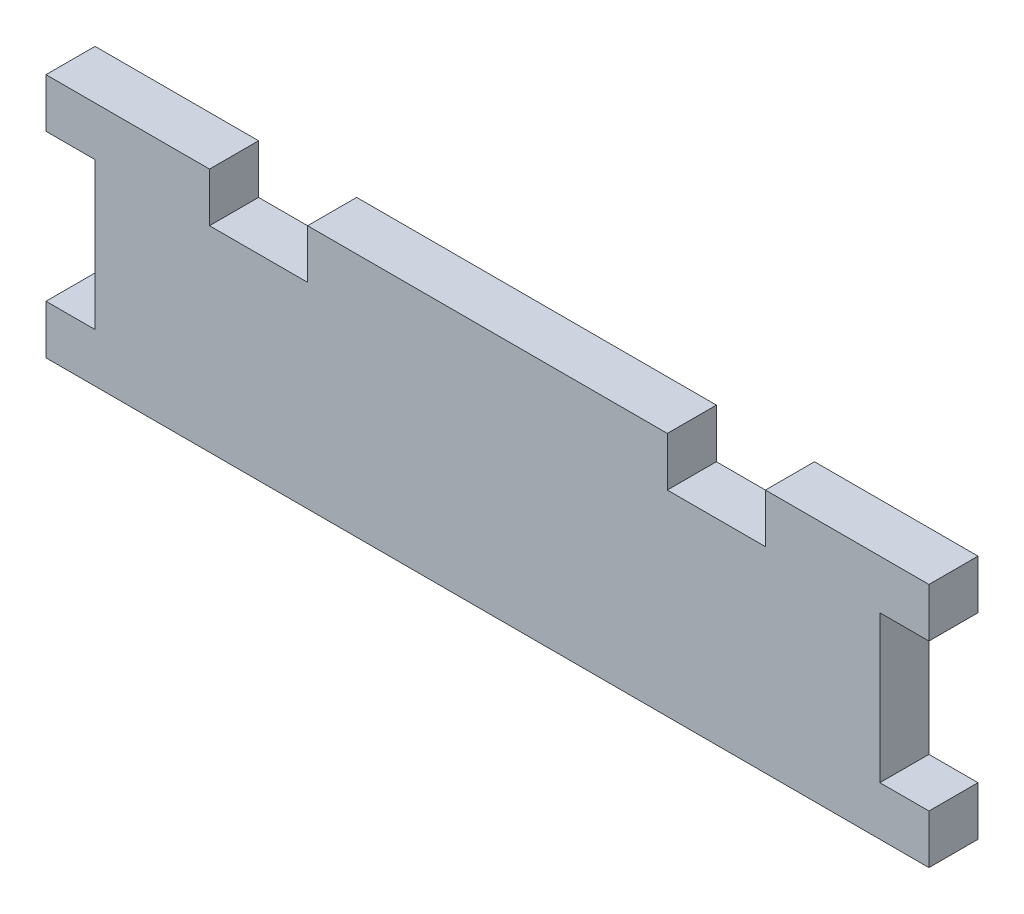
ISO-10303-21;
HEADER;
FILE_DESCRIPTION(('STEP AP214'),'2;1');
FILE_NAME('part.step','',(''),(''),'','','');
FILE_SCHEMA(('AUTOMOTIVE_DESIGN { 1 0 10303 214 1 1 1 1 }'));
ENDSEC;
DATA;
#1=APPLICATION_CONTEXT('core data for automotive mechanical design processes');
#2=APPLICATION_PROTOCOL_DEFINITION('international standard','automotive_design',2000,#1);
#3=PRODUCT_CONTEXT('',#1,'mechanical');
#4=PRODUCT('Part','Part','',(#3));
#5=PRODUCT_RELATED_PRODUCT_CATEGORY('part','',(#4));
#6=PRODUCT_DEFINITION_FORMATION('','',#4);
#7=PRODUCT_DEFINITION_CONTEXT('part definition',#1,'design');
#8=PRODUCT_DEFINITION('design','',#6,#7);
#9=PRODUCT_DEFINITION_SHAPE('','',#8);
#10=(LENGTH_UNIT() NAMED_UNIT(*) SI_UNIT(.MILLI.,.METRE.));
#11=(NAMED_UNIT(*) PLANE_ANGLE_UNIT() SI_UNIT($,.RADIAN.));
#12=(NAMED_UNIT(*) SI_UNIT($,.STERADIAN.) SOLID_ANGLE_UNIT());
#13=UNCERTAINTY_MEASURE_WITH_UNIT(LENGTH_MEASURE(1.E-05),#10,'distance_accuracy_value','');
#14=(GEOMETRIC_REPRESENTATION_CONTEXT(3) GLOBAL_UNCERTAINTY_ASSIGNED_CONTEXT((#13)) GLOBAL_UNIT_ASSIGNED_CONTEXT((#10,
#11,#12)) REPRESENTATION_CONTEXT('',''));
#15=CARTESIAN_POINT('',(0.,0.,0.));
#16=DIRECTION('',(0.,0.,1.));
#17=DIRECTION('',(1.,0.,0.));
#18=AXIS2_PLACEMENT_3D('',#15,#16,#17);
#19=CARTESIAN_POINT('',(38.,0.,3.));
#20=DIRECTION('',(1.,0.,0.));
#21=DIRECTION('',(0.,0.,-1.));
#22=AXIS2_PLACEMENT_3D('',#19,#20,#21);
#23=PLANE('',#22);
#24=DIRECTION('',(0.,-1.,0.));
#25=VECTOR('',#24,1.);
#26=CARTESIAN_POINT('',(38.,0.,0.));
#27=LINE('',#26,#25);
#28=CARTESIAN_POINT('',(38.,15.,0.));
#29=VERTEX_POINT('',#28);
#30=CARTESIAN_POINT('',(38.,12.,0.));
#31=VERTEX_POINT('',#30);
#32=EDGE_CURVE('E274',#29,#31,#27,.T.);
#33=ORIENTED_EDGE('',*,*,#32,.F.);
#34=DIRECTION('',(0.,0.,-1.));
#35=VECTOR('',#34,1.);
#36=CARTESIAN_POINT('',(38.,15.,3.));
#37=LINE('',#36,#35);
#38=CARTESIAN_POINT('',(38.,15.,3.));
#39=VERTEX_POINT('',#38);
#40=EDGE_CURVE('E11',#39,#29,#37,.T.);
#41=ORIENTED_EDGE('',*,*,#40,.F.);
#42=DIRECTION('',(0.,-1.,0.));
#43=VECTOR('',#42,1.);
#44=CARTESIAN_POINT('',(38.,0.,3.));
#45=LINE('',#44,#43);
#46=CARTESIAN_POINT('',(38.,12.,3.));
#47=VERTEX_POINT('',#46);
#48=EDGE_CURVE('E211',#39,#47,#45,.T.);
#49=ORIENTED_EDGE('',*,*,#48,.T.);
#50=DIRECTION('',(0.,0.,-1.));
#51=VECTOR('',#50,1.);
#52=CARTESIAN_POINT('',(38.,12.,3.));
#53=LINE('',#52,#51);
#54=EDGE_CURVE('E124',#47,#31,#53,.T.);
#55=ORIENTED_EDGE('',*,*,#54,.T.);
#56=EDGE_LOOP('',(#33,#41,#49,#55));
#57=FACE_BOUND('',#56,.T.);
#58=ADVANCED_FACE('F38',(#57),#23,.T.);
#59=CARTESIAN_POINT('',(0.,15.,3.));
#60=DIRECTION('',(0.,1.,0.));
#61=DIRECTION('',(-1.,0.,0.));
#62=AXIS2_PLACEMENT_3D('',#59,#60,#61);
#63=PLANE('',#62);
#64=DIRECTION('',(1.,0.,0.));
#65=VECTOR('',#64,1.);
#66=CARTESIAN_POINT('',(0.,15.,0.));
#67=LINE('',#66,#65);
#68=CARTESIAN_POINT('',(16.,15.,0.));
#69=VERTEX_POINT('',#68);
#70=EDGE_CURVE('E268',#69,#29,#67,.T.);
#71=ORIENTED_EDGE('',*,*,#70,.F.);
#72=DIRECTION('',(0.,0.,-1.));
#73=VECTOR('',#72,1.);
#74=CARTESIAN_POINT('',(16.,15.,3.));
#75=LINE('',#74,#73);
#76=CARTESIAN_POINT('',(16.,15.,3.));
#77=VERTEX_POINT('',#76);
#78=EDGE_CURVE('E46',#77,#69,#75,.T.);
#79=ORIENTED_EDGE('',*,*,#78,.F.);
#80=DIRECTION('',(1.,0.,0.));
#81=VECTOR('',#80,1.);
#82=CARTESIAN_POINT('',(0.,15.,3.));
#83=LINE('',#82,#81);
#84=EDGE_CURVE('E200',#77,#39,#83,.T.);
#85=ORIENTED_EDGE('',*,*,#84,.T.);
#86=ORIENTED_EDGE('',*,*,#40,.T.);
#87=EDGE_LOOP('',(#71,#79,#85,#86));
#88=FACE_BOUND('',#87,.T.);
#89=ADVANCED_FACE('F273',(#88),#63,.T.);
#90=CARTESIAN_POINT('',(16.,0.,3.));
#91=DIRECTION('',(1.,0.,0.));
#92=DIRECTION('',(0.,0.,-1.));
#93=AXIS2_PLACEMENT_3D('',#90,#91,#92);
#94=PLANE('',#93);
#95=DIRECTION('',(0.,-1.,0.));
#96=VECTOR('',#95,1.);
#97=CARTESIAN_POINT('',(16.,0.,0.));
#98=LINE('',#97,#96);
#99=CARTESIAN_POINT('',(16.,12.,0.));
#100=VERTEX_POINT('',#99);
#101=EDGE_CURVE('E262',#69,#100,#98,.T.);
#102=ORIENTED_EDGE('',*,*,#101,.T.);
#103=DIRECTION('',(0.,0.,-1.));
#104=VECTOR('',#103,1.);
#105=CARTESIAN_POINT('',(16.,12.,3.));
#106=LINE('',#105,#104);
#107=CARTESIAN_POINT('',(16.,12.,3.));
#108=VERTEX_POINT('',#107);
#109=EDGE_CURVE('E255',#108,#100,#106,.T.);
#110=ORIENTED_EDGE('',*,*,#109,.F.);
#111=DIRECTION('',(0.,-1.,0.));
#112=VECTOR('',#111,1.);
#113=CARTESIAN_POINT('',(16.,0.,3.));
#114=LINE('',#113,#112);
#115=EDGE_CURVE('E210',#77,#108,#114,.T.);
#116=ORIENTED_EDGE('',*,*,#115,.F.);
#117=ORIENTED_EDGE('',*,*,#78,.T.);
#118=EDGE_LOOP('',(#102,#110,#116,#117));
#119=FACE_BOUND('',#118,.T.);
#120=ADVANCED_FACE('F260',(#119),#94,.F.);
#121=CARTESIAN_POINT('',(0.,12.,3.));
#122=DIRECTION('',(0.,1.,0.));
#123=DIRECTION('',(0.,0.,1.));
#124=AXIS2_PLACEMENT_3D('',#121,#122,#123);
#125=PLANE('',#124);
#126=DIRECTION('',(1.,0.,0.));
#127=VECTOR('',#126,1.);
#128=CARTESIAN_POINT('',(0.,12.,0.));
#129=LINE('',#128,#127);
#130=CARTESIAN_POINT('',(10.,12.,0.));
#131=VERTEX_POINT('',#130);
#132=EDGE_CURVE('E271',#131,#100,#129,.T.);
#133=ORIENTED_EDGE('',*,*,#132,.F.);
#134=DIRECTION('',(0.,0.,-1.));
#135=VECTOR('',#134,1.);
#136=CARTESIAN_POINT('',(10.,12.,3.));
#137=LINE('',#136,#135);
#138=CARTESIAN_POINT('',(10.,12.,3.));
#139=VERTEX_POINT('',#138);
#140=EDGE_CURVE('E253',#139,#131,#137,.T.);
#141=ORIENTED_EDGE('',*,*,#140,.F.);
#142=DIRECTION('',(1.,0.,0.));
#143=VECTOR('',#142,1.);
#144=CARTESIAN_POINT('',(0.,12.,3.));
#145=LINE('',#144,#143);
#146=EDGE_CURVE('E214',#139,#108,#145,.T.);
#147=ORIENTED_EDGE('',*,*,#146,.T.);
#148=ORIENTED_EDGE('',*,*,#109,.T.);
#149=EDGE_LOOP('',(#133,#141,#147,#148));
#150=FACE_BOUND('',#149,.T.);
#151=ADVANCED_FACE('F323',(#150),#125,.T.);
#152=CARTESIAN_POINT('',(10.,0.,3.));
#153=DIRECTION('',(1.,0.,0.));
#154=DIRECTION('',(0.,0.,-1.));
#155=AXIS2_PLACEMENT_3D('',#152,#153,#154);
#156=PLANE('',#155);
#157=DIRECTION('',(0.,-1.,0.));
#158=VECTOR('',#157,1.);
#159=CARTESIAN_POINT('',(10.,0.,0.));
#160=LINE('',#159,#158);
#161=CARTESIAN_POINT('',(10.,15.,0.));
#162=VERTEX_POINT('',#161);
#163=EDGE_CURVE('E281',#162,#131,#160,.T.);
#164=ORIENTED_EDGE('',*,*,#163,.F.);
#165=DIRECTION('',(0.,0.,-1.));
#166=VECTOR('',#165,1.);
#167=CARTESIAN_POINT('',(10.,15.,3.));
#168=LINE('',#167,#166);
#169=CARTESIAN_POINT('',(10.,15.,3.));
#170=VERTEX_POINT('',#169);
#171=EDGE_CURVE('E251',#170,#162,#168,.T.);
#172=ORIENTED_EDGE('',*,*,#171,.F.);
#173=DIRECTION('',(0.,-1.,0.));
#174=VECTOR('',#173,1.);
#175=CARTESIAN_POINT('',(10.,0.,3.));
#176=LINE('',#175,#174);
#177=EDGE_CURVE('E208',#170,#139,#176,.T.);
#178=ORIENTED_EDGE('',*,*,#177,.T.);
#179=ORIENTED_EDGE('',*,*,#140,.T.);
#180=EDGE_LOOP('',(#164,#172,#178,#179));
#181=FACE_BOUND('',#180,.T.);
#182=ADVANCED_FACE('F328',(#181),#156,.T.);
#183=CARTESIAN_POINT('',(0.,15.,0.));
#184=VERTEX_POINT('',#183);
#185=EDGE_CURVE('E276',#184,#162,#67,.T.);
#186=ORIENTED_EDGE('',*,*,#185,.F.);
#187=DIRECTION('',(0.,0.,-1.));
#188=VECTOR('',#187,1.);
#189=CARTESIAN_POINT('',(0.,15.,3.));
#190=LINE('',#189,#188);
#191=CARTESIAN_POINT('',(0.,15.,3.));
#192=VERTEX_POINT('',#191);
#193=EDGE_CURVE('E249',#192,#184,#190,.T.);
#194=ORIENTED_EDGE('',*,*,#193,.F.);
#195=EDGE_CURVE('E199',#192,#170,#83,.T.);
#196=ORIENTED_EDGE('',*,*,#195,.T.);
#197=ORIENTED_EDGE('',*,*,#171,.T.);
#198=EDGE_LOOP('',(#186,#194,#196,#197));
#199=FACE_BOUND('',#198,.T.);
#200=ADVANCED_FACE('F319',(#199),#63,.T.);
#201=CARTESIAN_POINT('',(0.,0.,3.));
#202=DIRECTION('',(-1.,0.,0.));
#203=DIRECTION('',(0.,0.,1.));
#204=AXIS2_PLACEMENT_3D('',#201,#202,#203);
#205=PLANE('',#204);
#206=DIRECTION('',(0.,1.,0.));
#207=VECTOR('',#206,1.);
#208=CARTESIAN_POINT('',(0.,0.,0.));
#209=LINE('',#208,#207);
#210=CARTESIAN_POINT('',(0.,12.,0.));
#211=VERTEX_POINT('',#210);
#212=EDGE_CURVE('E280',#211,#184,#209,.T.);
#213=ORIENTED_EDGE('',*,*,#212,.F.);
#214=DIRECTION('',(0.,0.,-1.));
#215=VECTOR('',#214,1.);
#216=CARTESIAN_POINT('',(0.,12.,3.));
#217=LINE('',#216,#215);
#218=CARTESIAN_POINT('',(0.,12.,3.));
#219=VERTEX_POINT('',#218);
#220=EDGE_CURVE('E247',#219,#211,#217,.T.);
#221=ORIENTED_EDGE('',*,*,#220,.F.);
#222=DIRECTION('',(0.,1.,0.));
#223=VECTOR('',#222,1.);
#224=CARTESIAN_POINT('',(0.,0.,3.));
#225=LINE('',#224,#223);
#226=EDGE_CURVE('E207',#219,#192,#225,.T.);
#227=ORIENTED_EDGE('',*,*,#226,.T.);
#228=ORIENTED_EDGE('',*,*,#193,.T.);
#229=EDGE_LOOP('',(#213,#221,#227,#228));
#230=FACE_BOUND('',#229,.T.);
#231=ADVANCED_FACE('F327',(#230),#205,.T.);
#232=CARTESIAN_POINT('',(0.,12.,3.));
#233=DIRECTION('',(0.,1.,0.));
#234=DIRECTION('',(0.,0.,1.));
#235=AXIS2_PLACEMENT_3D('',#232,#233,#234);
#236=PLANE('',#235);
#237=DIRECTION('',(1.,0.,0.));
#238=VECTOR('',#237,1.);
#239=CARTESIAN_POINT('',(0.,12.,0.));
#240=LINE('',#239,#238);
#241=CARTESIAN_POINT('',(3.,12.,0.));
#242=VERTEX_POINT('',#241);
#243=EDGE_CURVE('E284',#211,#242,#240,.T.);
#244=ORIENTED_EDGE('',*,*,#243,.T.);
#245=DIRECTION('',(0.,0.,-1.));
#246=VECTOR('',#245,1.);
#247=CARTESIAN_POINT('',(3.,12.,3.));
#248=LINE('',#247,#246);
#249=CARTESIAN_POINT('',(3.,12.,3.));
#250=VERTEX_POINT('',#249);
#251=EDGE_CURVE('E244',#250,#242,#248,.T.);
#252=ORIENTED_EDGE('',*,*,#251,.F.);
#253=DIRECTION('',(1.,0.,0.));
#254=VECTOR('',#253,1.);
#255=CARTESIAN_POINT('',(0.,12.,3.));
#256=LINE('',#255,#254);
#257=EDGE_CURVE('E385',#219,#250,#256,.T.);
#258=ORIENTED_EDGE('',*,*,#257,.F.);
#259=ORIENTED_EDGE('',*,*,#220,.T.);
#260=EDGE_LOOP('',(#244,#252,#258,#259));
#261=FACE_BOUND('',#260,.T.);
#262=ADVANCED_FACE('F404',(#261),#236,.F.);
#263=CARTESIAN_POINT('',(3.,0.,3.));
#264=DIRECTION('',(1.,0.,0.));
#265=DIRECTION('',(0.,1.,0.));
#266=AXIS2_PLACEMENT_3D('',#263,#264,#265);
#267=PLANE('',#266);
#268=DIRECTION('',(0.,-1.,0.));
#269=VECTOR('',#268,1.);
#270=CARTESIAN_POINT('',(3.,0.,0.));
#271=LINE('',#270,#269);
#272=CARTESIAN_POINT('',(3.,3.,0.));
#273=VERTEX_POINT('',#272);
#274=EDGE_CURVE('E292',#242,#273,#271,.T.);
#275=ORIENTED_EDGE('',*,*,#274,.T.);
#276=DIRECTION('',(0.,0.,-1.));
#277=VECTOR('',#276,1.);
#278=CARTESIAN_POINT('',(3.,3.,3.));
#279=LINE('',#278,#277);
#280=CARTESIAN_POINT('',(3.,3.,3.));
#281=VERTEX_POINT('',#280);
#282=EDGE_CURVE('E242',#281,#273,#279,.T.);
#283=ORIENTED_EDGE('',*,*,#282,.F.);
#284=DIRECTION('',(0.,-1.,0.));
#285=VECTOR('',#284,1.);
#286=CARTESIAN_POINT('',(3.,0.,3.));
#287=LINE('',#286,#285);
#288=EDGE_CURVE('E383',#250,#281,#287,.T.);
#289=ORIENTED_EDGE('',*,*,#288,.F.);
#290=ORIENTED_EDGE('',*,*,#251,.T.);
#291=EDGE_LOOP('',(#275,#283,#289,#290));
#292=FACE_BOUND('',#291,.T.);
#293=ADVANCED_FACE('F411',(#292),#267,.F.);
#294=CARTESIAN_POINT('',(0.,3.,3.));
#295=DIRECTION('',(0.,1.,0.));
#296=DIRECTION('',(0.,0.,1.));
#297=AXIS2_PLACEMENT_3D('',#294,#295,#296);
#298=PLANE('',#297);
#299=DIRECTION('',(1.,0.,0.));
#300=VECTOR('',#299,1.);
#301=CARTESIAN_POINT('',(0.,3.,0.));
#302=LINE('',#301,#300);
#303=CARTESIAN_POINT('',(0.,3.,0.));
#304=VERTEX_POINT('',#303);
#305=EDGE_CURVE('E295',#304,#273,#302,.T.);
#306=ORIENTED_EDGE('',*,*,#305,.F.);
#307=DIRECTION('',(0.,0.,-1.));
#308=VECTOR('',#307,1.);
#309=CARTESIAN_POINT('',(0.,3.,3.));
#310=LINE('',#309,#308);
#311=CARTESIAN_POINT('',(0.,3.,3.));
#312=VERTEX_POINT('',#311);
#313=EDGE_CURVE('E240',#312,#304,#310,.T.);
#314=ORIENTED_EDGE('',*,*,#313,.F.);
#315=DIRECTION('',(1.,0.,0.));
#316=VECTOR('',#315,1.);
#317=CARTESIAN_POINT('',(0.,3.,3.));
#318=LINE('',#317,#316);
#319=EDGE_CURVE('E380',#312,#281,#318,.T.);
#320=ORIENTED_EDGE('',*,*,#319,.T.);
#321=ORIENTED_EDGE('',*,*,#282,.T.);
#322=EDGE_LOOP('',(#306,#314,#320,#321));
#323=FACE_BOUND('',#322,.T.);
#324=ADVANCED_FACE('F415',(#323),#298,.T.);
#325=CARTESIAN_POINT('',(0.,0.,0.));
#326=VERTEX_POINT('',#325);
#327=EDGE_CURVE('E286',#326,#304,#209,.T.);
#328=ORIENTED_EDGE('',*,*,#327,.F.);
#329=DIRECTION('',(0.,0.,-1.));
#330=VECTOR('',#329,1.);
#331=CARTESIAN_POINT('',(0.,0.,3.));
#332=LINE('',#331,#330);
#333=CARTESIAN_POINT('',(0.,0.,3.));
#334=VERTEX_POINT('',#333);
#335=EDGE_CURVE('E238',#334,#326,#332,.T.);
#336=ORIENTED_EDGE('',*,*,#335,.F.);
#337=EDGE_CURVE('E379',#334,#312,#225,.T.);
#338=ORIENTED_EDGE('',*,*,#337,.T.);
#339=ORIENTED_EDGE('',*,*,#313,.T.);
#340=EDGE_LOOP('',(#328,#336,#338,#339));
#341=FACE_BOUND('',#340,.T.);
#342=ADVANCED_FACE('F354',(#341),#205,.T.);
#343=CARTESIAN_POINT('',(0.,0.,3.));
#344=DIRECTION('',(0.,1.,0.));
#345=DIRECTION('',(0.,0.,1.));
#346=AXIS2_PLACEMENT_3D('',#343,#344,#345);
#347=PLANE('',#346);
#348=DIRECTION('',(1.,0.,0.));
#349=VECTOR('',#348,1.);
#350=CARTESIAN_POINT('',(0.,0.,0.));
#351=LINE('',#350,#349);
#352=CARTESIAN_POINT('',(54.,0.,0.));
#353=VERTEX_POINT('',#352);
#354=EDGE_CURVE('E298',#326,#353,#351,.T.);
#355=ORIENTED_EDGE('',*,*,#354,.T.);
#356=DIRECTION('',(0.,0.,-1.));
#357=VECTOR('',#356,1.);
#358=CARTESIAN_POINT('',(54.,0.,3.));
#359=LINE('',#358,#357);
#360=CARTESIAN_POINT('',(54.,0.,3.));
#361=VERTEX_POINT('',#360);
#362=EDGE_CURVE('E235',#361,#353,#359,.T.);
#363=ORIENTED_EDGE('',*,*,#362,.F.);
#364=DIRECTION('',(1.,0.,0.));
#365=VECTOR('',#364,1.);
#366=CARTESIAN_POINT('',(0.,0.,3.));
#367=LINE('',#366,#365);
#368=EDGE_CURVE('E377',#334,#361,#367,.T.);
#369=ORIENTED_EDGE('',*,*,#368,.F.);
#370=ORIENTED_EDGE('',*,*,#335,.T.);
#371=EDGE_LOOP('',(#355,#363,#369,#370));
#372=FACE_BOUND('',#371,.T.);
#373=ADVANCED_FACE('F346',(#372),#347,.F.);
#374=CARTESIAN_POINT('',(54.,0.,3.));
#375=DIRECTION('',(-1.,0.,0.));
#376=DIRECTION('',(0.,0.,1.));
#377=AXIS2_PLACEMENT_3D('',#374,#375,#376);
#378=PLANE('',#377);
#379=DIRECTION('',(0.,1.,0.));
#380=VECTOR('',#379,1.);
#381=CARTESIAN_POINT('',(54.,0.,0.));
#382=LINE('',#381,#380);
#383=CARTESIAN_POINT('',(54.,3.,0.));
#384=VERTEX_POINT('',#383);
#385=EDGE_CURVE('E300',#353,#384,#382,.T.);
#386=ORIENTED_EDGE('',*,*,#385,.T.);
#387=DIRECTION('',(0.,0.,-1.));
#388=VECTOR('',#387,1.);
#389=CARTESIAN_POINT('',(54.,3.,3.));
#390=LINE('',#389,#388);
#391=CARTESIAN_POINT('',(54.,3.,3.));
#392=VERTEX_POINT('',#391);
#393=EDGE_CURVE('E232',#392,#384,#390,.T.);
#394=ORIENTED_EDGE('',*,*,#393,.F.);
#395=DIRECTION('',(0.,1.,0.));
#396=VECTOR('',#395,1.);
#397=CARTESIAN_POINT('',(54.,0.,3.));
#398=LINE('',#397,#396);
#399=EDGE_CURVE('E203',#361,#392,#398,.T.);
#400=ORIENTED_EDGE('',*,*,#399,.F.);
#401=ORIENTED_EDGE('',*,*,#362,.T.);
#402=EDGE_LOOP('',(#386,#394,#400,#401));
#403=FACE_BOUND('',#402,.T.);
#404=ADVANCED_FACE('F337',(#403),#378,.F.);
#405=CARTESIAN_POINT('',(0.,3.,3.));
#406=DIRECTION('',(0.,-1.,0.));
#407=DIRECTION('',(0.,0.,-1.));
#408=AXIS2_PLACEMENT_3D('',#405,#406,#407);
#409=PLANE('',#408);
#410=DIRECTION('',(-1.,0.,0.));
#411=VECTOR('',#410,1.);
#412=CARTESIAN_POINT('',(0.,3.,0.));
#413=LINE('',#412,#411);
#414=CARTESIAN_POINT('',(51.,3.,0.));
#415=VERTEX_POINT('',#414);
#416=EDGE_CURVE('E302',#384,#415,#413,.T.);
#417=ORIENTED_EDGE('',*,*,#416,.T.);
#418=DIRECTION('',(0.,0.,-1.));
#419=VECTOR('',#418,1.);
#420=CARTESIAN_POINT('',(51.,3.,3.));
#421=LINE('',#420,#419);
#422=CARTESIAN_POINT('',(51.,3.,3.));
#423=VERTEX_POINT('',#422);
#424=EDGE_CURVE('E230',#423,#415,#421,.T.);
#425=ORIENTED_EDGE('',*,*,#424,.F.);
#426=DIRECTION('',(-1.,0.,0.));
#427=VECTOR('',#426,1.);
#428=CARTESIAN_POINT('',(0.,3.,3.));
#429=LINE('',#428,#427);
#430=EDGE_CURVE('E365',#392,#423,#429,.T.);
#431=ORIENTED_EDGE('',*,*,#430,.F.);
#432=ORIENTED_EDGE('',*,*,#393,.T.);
#433=EDGE_LOOP('',(#417,#425,#431,#432));
#434=FACE_BOUND('',#433,.T.);
#435=ADVANCED_FACE('F345',(#434),#409,.F.);
#436=CARTESIAN_POINT('',(51.,0.,3.));
#437=DIRECTION('',(1.,0.,0.));
#438=DIRECTION('',(0.,0.,-1.));
#439=AXIS2_PLACEMENT_3D('',#436,#437,#438);
#440=PLANE('',#439);
#441=DIRECTION('',(0.,-1.,0.));
#442=VECTOR('',#441,1.);
#443=CARTESIAN_POINT('',(51.,0.,0.));
#444=LINE('',#443,#442);
#445=CARTESIAN_POINT('',(51.,12.,0.));
#446=VERTEX_POINT('',#445);
#447=EDGE_CURVE('E305',#446,#415,#444,.T.);
#448=ORIENTED_EDGE('',*,*,#447,.F.);
#449=DIRECTION('',(0.,0.,-1.));
#450=VECTOR('',#449,1.);
#451=CARTESIAN_POINT('',(51.,12.,3.));
#452=LINE('',#451,#450);
#453=CARTESIAN_POINT('',(51.,12.,3.));
#454=VERTEX_POINT('',#453);
#455=EDGE_CURVE('E228',#454,#446,#452,.T.);
#456=ORIENTED_EDGE('',*,*,#455,.F.);
#457=DIRECTION('',(0.,-1.,0.));
#458=VECTOR('',#457,1.);
#459=CARTESIAN_POINT('',(51.,0.,3.));
#460=LINE('',#459,#458);
#461=EDGE_CURVE('E370',#454,#423,#460,.T.);
#462=ORIENTED_EDGE('',*,*,#461,.T.);
#463=ORIENTED_EDGE('',*,*,#424,.T.);
#464=EDGE_LOOP('',(#448,#456,#462,#463));
#465=FACE_BOUND('',#464,.T.);
#466=ADVANCED_FACE('F341',(#465),#440,.T.);
#467=CARTESIAN_POINT('',(0.,12.,3.));
#468=DIRECTION('',(0.,-1.,0.));
#469=DIRECTION('',(1.,0.,0.));
#470=AXIS2_PLACEMENT_3D('',#467,#468,#469);
#471=PLANE('',#470);
#472=DIRECTION('',(-1.,0.,0.));
#473=VECTOR('',#472,1.);
#474=CARTESIAN_POINT('',(0.,12.,0.));
#475=LINE('',#474,#473);
#476=CARTESIAN_POINT('',(54.,12.,0.));
#477=VERTEX_POINT('',#476);
#478=EDGE_CURVE('E307',#477,#446,#475,.T.);
#479=ORIENTED_EDGE('',*,*,#478,.F.);
#480=DIRECTION('',(0.,0.,-1.));
#481=VECTOR('',#480,1.);
#482=CARTESIAN_POINT('',(54.,12.,3.));
#483=LINE('',#482,#481);
#484=CARTESIAN_POINT('',(54.,12.,3.));
#485=VERTEX_POINT('',#484);
#486=EDGE_CURVE('E226',#485,#477,#483,.T.);
#487=ORIENTED_EDGE('',*,*,#486,.F.);
#488=DIRECTION('',(-1.,0.,0.));
#489=VECTOR('',#488,1.);
#490=CARTESIAN_POINT('',(0.,12.,3.));
#491=LINE('',#490,#489);
#492=EDGE_CURVE('E201',#485,#454,#491,.T.);
#493=ORIENTED_EDGE('',*,*,#492,.T.);
#494=ORIENTED_EDGE('',*,*,#455,.T.);
#495=EDGE_LOOP('',(#479,#487,#493,#494));
#496=FACE_BOUND('',#495,.T.);
#497=ADVANCED_FACE('F336',(#496),#471,.T.);
#498=CARTESIAN_POINT('',(54.,15.,0.));
#499=VERTEX_POINT('',#498);
#500=EDGE_CURVE('E278',#477,#499,#382,.T.);
#501=ORIENTED_EDGE('',*,*,#500,.T.);
#502=DIRECTION('',(0.,0.,-1.));
#503=VECTOR('',#502,1.);
#504=CARTESIAN_POINT('',(54.,15.,3.));
#505=LINE('',#504,#503);
#506=CARTESIAN_POINT('',(54.,15.,3.));
#507=VERTEX_POINT('',#506);
#508=EDGE_CURVE('E187',#507,#499,#505,.T.);
#509=ORIENTED_EDGE('',*,*,#508,.F.);
#510=EDGE_CURVE('E196',#485,#507,#398,.T.);
#511=ORIENTED_EDGE('',*,*,#510,.F.);
#512=ORIENTED_EDGE('',*,*,#486,.T.);
#513=EDGE_LOOP('',(#501,#509,#511,#512));
#514=FACE_BOUND('',#513,.T.);
#515=ADVANCED_FACE('F313',(#514),#378,.F.);
#516=CARTESIAN_POINT('',(44.,15.,0.));
#517=VERTEX_POINT('',#516);
#518=EDGE_CURVE('E186',#517,#499,#67,.T.);
#519=ORIENTED_EDGE('',*,*,#518,.F.);
#520=DIRECTION('',(0.,0.,-1.));
#521=VECTOR('',#520,1.);
#522=CARTESIAN_POINT('',(44.,15.,3.));
#523=LINE('',#522,#521);
#524=CARTESIAN_POINT('',(44.,15.,3.));
#525=VERTEX_POINT('',#524);
#526=EDGE_CURVE('E180',#525,#517,#523,.T.);
#527=ORIENTED_EDGE('',*,*,#526,.F.);
#528=EDGE_CURVE('E184',#525,#507,#83,.T.);
#529=ORIENTED_EDGE('',*,*,#528,.T.);
#530=ORIENTED_EDGE('',*,*,#508,.T.);
#531=EDGE_LOOP('',(#519,#527,#529,#530));
#532=FACE_BOUND('',#531,.T.);
#533=ADVANCED_FACE('F182',(#532),#63,.T.);
#534=CARTESIAN_POINT('',(44.,1.01770443923973E-13,3.));
#535=DIRECTION('',(1.,0.,0.));
#536=DIRECTION('',(0.,1.,0.));
#537=AXIS2_PLACEMENT_3D('',#534,#535,#536);
#538=PLANE('',#537);
#539=DIRECTION('',(0.,-1.,0.));
#540=VECTOR('',#539,1.);
#541=CARTESIAN_POINT('',(44.,1.01770443923973E-13,0.));
#542=LINE('',#541,#540);
#543=CARTESIAN_POINT('',(44.,12.,0.));
#544=VERTEX_POINT('',#543);
#545=EDGE_CURVE('E117',#517,#544,#542,.T.);
#546=ORIENTED_EDGE('',*,*,#545,.T.);
#547=DIRECTION('',(0.,0.,-1.));
#548=VECTOR('',#547,1.);
#549=CARTESIAN_POINT('',(44.,12.,3.));
#550=LINE('',#549,#548);
#551=CARTESIAN_POINT('',(44.,12.,3.));
#552=VERTEX_POINT('',#551);
#553=EDGE_CURVE('E188',#552,#544,#550,.T.);
#554=ORIENTED_EDGE('',*,*,#553,.F.);
#555=DIRECTION('',(0.,-1.,0.));
#556=VECTOR('',#555,1.);
#557=CARTESIAN_POINT('',(44.,1.01770443923973E-13,3.));
#558=LINE('',#557,#556);
#559=EDGE_CURVE('E190',#525,#552,#558,.T.);
#560=ORIENTED_EDGE('',*,*,#559,.F.);
#561=ORIENTED_EDGE('',*,*,#526,.T.);
#562=EDGE_LOOP('',(#546,#554,#560,#561));
#563=FACE_BOUND('',#562,.T.);
#564=ADVANCED_FACE('F191',(#563),#538,.F.);
#565=CARTESIAN_POINT('',(0.,12.,3.));
#566=DIRECTION('',(0.,-1.,0.));
#567=DIRECTION('',(0.,0.,-1.));
#568=AXIS2_PLACEMENT_3D('',#565,#566,#567);
#569=PLANE('',#568);
#570=DIRECTION('',(-1.,0.,0.));
#571=VECTOR('',#570,1.);
#572=CARTESIAN_POINT('',(0.,12.,0.));
#573=LINE('',#572,#571);
#574=EDGE_CURVE('E215',#544,#31,#573,.T.);
#575=ORIENTED_EDGE('',*,*,#574,.T.);
#576=ORIENTED_EDGE('',*,*,#54,.F.);
#577=DIRECTION('',(-1.,0.,0.));
#578=VECTOR('',#577,1.);
#579=CARTESIAN_POINT('',(0.,12.,3.));
#580=LINE('',#579,#578);
#581=EDGE_CURVE('E54',#552,#47,#580,.T.);
#582=ORIENTED_EDGE('',*,*,#581,.F.);
#583=ORIENTED_EDGE('',*,*,#553,.T.);
#584=EDGE_LOOP('',(#575,#576,#582,#583));
#585=FACE_BOUND('',#584,.T.);
#586=ADVANCED_FACE('F335',(#585),#569,.F.);
#587=CARTESIAN_POINT('',(0.,0.,3.));
#588=DIRECTION('',(0.,0.,1.));
#589=DIRECTION('',(1.,0.,0.));
#590=AXIS2_PLACEMENT_3D('',#587,#588,#589);
#591=PLANE('',#590);
#592=ORIENTED_EDGE('',*,*,#48,.F.);
#593=ORIENTED_EDGE('',*,*,#84,.F.);
#594=ORIENTED_EDGE('',*,*,#115,.T.);
#595=ORIENTED_EDGE('',*,*,#146,.F.);
#596=ORIENTED_EDGE('',*,*,#177,.F.);
#597=ORIENTED_EDGE('',*,*,#195,.F.);
#598=ORIENTED_EDGE('',*,*,#226,.F.);
#599=ORIENTED_EDGE('',*,*,#257,.T.);
#600=ORIENTED_EDGE('',*,*,#288,.T.);
#601=ORIENTED_EDGE('',*,*,#319,.F.);
#602=ORIENTED_EDGE('',*,*,#337,.F.);
#603=ORIENTED_EDGE('',*,*,#368,.T.);
#604=ORIENTED_EDGE('',*,*,#399,.T.);
#605=ORIENTED_EDGE('',*,*,#430,.T.);
#606=ORIENTED_EDGE('',*,*,#461,.F.);
#607=ORIENTED_EDGE('',*,*,#492,.F.);
#608=ORIENTED_EDGE('',*,*,#510,.T.);
#609=ORIENTED_EDGE('',*,*,#528,.F.);
#610=ORIENTED_EDGE('',*,*,#559,.T.);
#611=ORIENTED_EDGE('',*,*,#581,.T.);
#612=EDGE_LOOP('',(#592,#593,#594,#595,#596,#597,#598,#599,#600,#601,#602,#603,#604,#605,#606,
#607,#608,#609,#610,#611));
#613=FACE_BOUND('',#612,.T.);
#614=ADVANCED_FACE('F193',(#613),#591,.T.);
#615=CARTESIAN_POINT('',(0.,0.,0.));
#616=DIRECTION('',(0.,0.,1.));
#617=DIRECTION('',(1.,0.,0.));
#618=AXIS2_PLACEMENT_3D('',#615,#616,#617);
#619=PLANE('',#618);
#620=ORIENTED_EDGE('',*,*,#32,.T.);
#621=ORIENTED_EDGE('',*,*,#574,.F.);
#622=ORIENTED_EDGE('',*,*,#545,.F.);
#623=ORIENTED_EDGE('',*,*,#518,.T.);
#624=ORIENTED_EDGE('',*,*,#500,.F.);
#625=ORIENTED_EDGE('',*,*,#478,.T.);
#626=ORIENTED_EDGE('',*,*,#447,.T.);
#627=ORIENTED_EDGE('',*,*,#416,.F.);
#628=ORIENTED_EDGE('',*,*,#385,.F.);
#629=ORIENTED_EDGE('',*,*,#354,.F.);
#630=ORIENTED_EDGE('',*,*,#327,.T.);
#631=ORIENTED_EDGE('',*,*,#305,.T.);
#632=ORIENTED_EDGE('',*,*,#274,.F.);
#633=ORIENTED_EDGE('',*,*,#243,.F.);
#634=ORIENTED_EDGE('',*,*,#212,.T.);
#635=ORIENTED_EDGE('',*,*,#185,.T.);
#636=ORIENTED_EDGE('',*,*,#163,.T.);
#637=ORIENTED_EDGE('',*,*,#132,.T.);
#638=ORIENTED_EDGE('',*,*,#101,.F.);
#639=ORIENTED_EDGE('',*,*,#70,.T.);
#640=EDGE_LOOP('',(#620,#621,#622,#623,#624,#625,#626,#627,#628,#629,#630,#631,#632,#633,#634,
#635,#636,#637,#638,#639));
#641=FACE_BOUND('',#640,.T.);
#642=ADVANCED_FACE('F267',(#641),#619,.F.);
#643=CLOSED_SHELL('',(#58,#89,#120,#151,#182,#200,#231,#262,#293,#324,#342,#373,#404,#435,#466,
#497,#515,#533,#564,#586,#614,#642));
#644=MANIFOLD_SOLID_BREP('B2',#643);
#645=ADVANCED_BREP_SHAPE_REPRESENTATION('',(#18,#644),#14);
#646=SHAPE_DEFINITION_REPRESENTATION(#9,#645);
ENDSEC;
END-ISO-10303-21;
